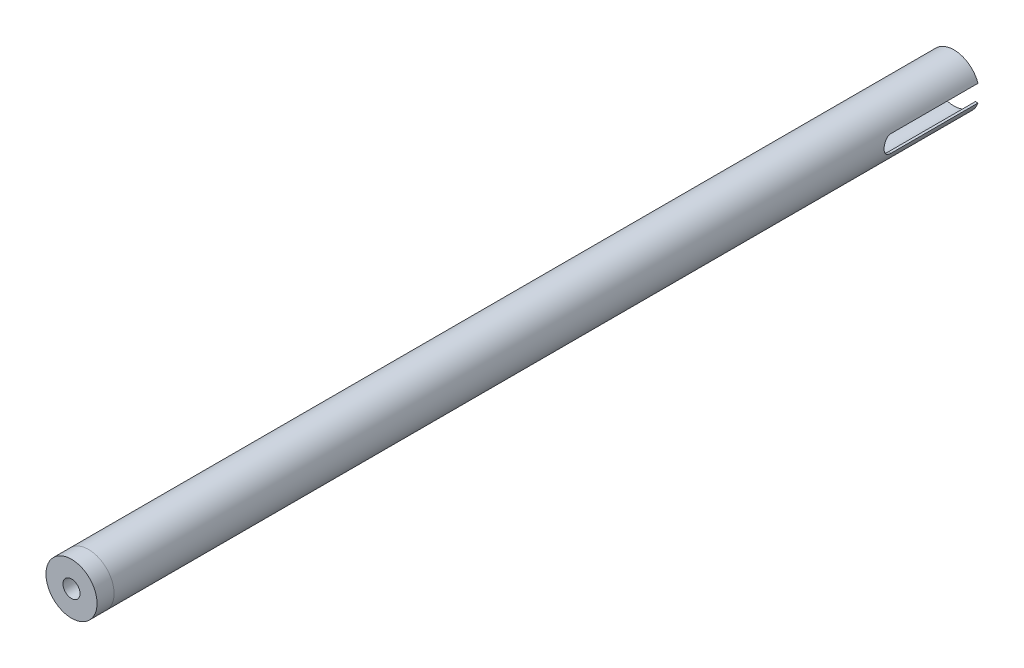
ISO-10303-21;
HEADER;
FILE_DESCRIPTION(('STEP AP214'),'2;1');
FILE_NAME('part.step','',(''),(''),'','','');
FILE_SCHEMA(('AUTOMOTIVE_DESIGN { 1 0 10303 214 1 1 1 1 }'));
ENDSEC;
DATA;
#1=APPLICATION_CONTEXT('core data for automotive mechanical design processes');
#2=APPLICATION_PROTOCOL_DEFINITION('international standard','automotive_design',2000,#1);
#3=PRODUCT_CONTEXT('',#1,'mechanical');
#4=PRODUCT('Part','Part','',(#3));
#5=PRODUCT_RELATED_PRODUCT_CATEGORY('part','',(#4));
#6=PRODUCT_DEFINITION_FORMATION('','',#4);
#7=PRODUCT_DEFINITION_CONTEXT('part definition',#1,'design');
#8=PRODUCT_DEFINITION('design','',#6,#7);
#9=PRODUCT_DEFINITION_SHAPE('','',#8);
#10=(LENGTH_UNIT() NAMED_UNIT(*) SI_UNIT(.MILLI.,.METRE.));
#11=(NAMED_UNIT(*) PLANE_ANGLE_UNIT() SI_UNIT($,.RADIAN.));
#12=(NAMED_UNIT(*) SI_UNIT($,.STERADIAN.) SOLID_ANGLE_UNIT());
#13=UNCERTAINTY_MEASURE_WITH_UNIT(LENGTH_MEASURE(1.E-05),#10,'distance_accuracy_value','');
#14=(GEOMETRIC_REPRESENTATION_CONTEXT(3) GLOBAL_UNCERTAINTY_ASSIGNED_CONTEXT((#13)) GLOBAL_UNIT_ASSIGNED_CONTEXT((#10,
#11,#12)) REPRESENTATION_CONTEXT('',''));
#15=CARTESIAN_POINT('',(0.,0.,0.));
#16=DIRECTION('',(0.,0.,1.));
#17=DIRECTION('',(1.,0.,0.));
#18=AXIS2_PLACEMENT_3D('',#15,#16,#17);
#19=CARTESIAN_POINT('',(0.,0.,-329.057104319801));
#20=DIRECTION('',(0.,0.,1.));
#21=DIRECTION('',(1.,0.,0.));
#22=AXIS2_PLACEMENT_3D('',#19,#20,#21);
#23=CYLINDRICAL_SURFACE('',#22,9.525);
#24=CARTESIAN_POINT('',(0.,0.,-6.35));
#25=DIRECTION('',(0.,0.,1.));
#26=DIRECTION('',(1.,0.,0.));
#27=AXIS2_PLACEMENT_3D('',#24,#25,#26);
#28=CIRCLE('',#27,9.525);
#29=CARTESIAN_POINT('',(9.525,0.,-6.35));
#30=VERTEX_POINT('',#29);
#31=EDGE_CURVE('E167',#30,#30,#28,.T.);
#32=ORIENTED_EDGE('',*,*,#31,.F.);
#33=EDGE_LOOP('',(#32));
#34=FACE_BOUND('',#33,.T.);
#35=CARTESIAN_POINT('',(-8.98025612106915,3.175,-296.672104319801));
#36=CARTESIAN_POINT('',(-8.98024230233901,3.17501142134308,-296.585478216465));
#37=CARTESIAN_POINT('',(-8.98150922759707,3.17145501317748,-296.498859833989));
#38=CARTESIAN_POINT('',(-8.98650170400112,3.1572955094353,-296.326295019163));
#39=CARTESIAN_POINT('',(-8.99022659113085,3.14669431699565,-296.240348411677));
#40=CARTESIAN_POINT('',(-9.00001740508998,3.11857670914846,-296.069994170512));
#41=CARTESIAN_POINT('',(-9.00607621805003,3.10108130380329,-295.985582668705));
#42=CARTESIAN_POINT('',(-9.02033586435303,3.05935434973544,-295.81864786737));
#43=CARTESIAN_POINT('',(-9.02853677497232,3.03512255799513,-295.736124636078));
#44=CARTESIAN_POINT('',(-9.05598792154067,2.95264369348964,-295.492326012802));
#45=CARTESIAN_POINT('',(-9.07810200713863,2.88457148458963,-295.334572428477));
#46=CARTESIAN_POINT('',(-9.12745136023601,2.72437908867645,-295.032695909988));
#47=CARTESIAN_POINT('',(-9.15468995097455,2.63224328129308,-294.88858191276));
#48=CARTESIAN_POINT('',(-9.21240416673121,2.42269155952414,-294.612429052936));
#49=CARTESIAN_POINT('',(-9.24296008478943,2.30449853156512,-294.480995471073));
#50=CARTESIAN_POINT('',(-9.30318902123142,2.04784031127145,-294.239400174736));
#51=CARTESIAN_POINT('',(-9.33286185998227,1.90937102786996,-294.129242763504));
#52=CARTESIAN_POINT('',(-9.38892492365178,1.61159672697579,-293.930525752016));
#53=CARTESIAN_POINT('',(-9.41520772598947,1.45183792838571,-293.842613566006));
#54=CARTESIAN_POINT('',(-9.46054712430069,1.11883883316163,-293.695208839936));
#55=CARTESIAN_POINT('',(-9.47961052807859,0.945611424033776,-293.635689511935));
#56=CARTESIAN_POINT('',(-9.50410661247238,0.642992499572378,-293.560210747439));
#57=CARTESIAN_POINT('',(-9.51189798251809,0.515662964136021,-293.536592775396));
#58=CARTESIAN_POINT('',(-9.51973491912187,0.323120458247706,-293.512926509222));
#59=CARTESIAN_POINT('',(-9.52170555244691,0.258670486244995,-293.506997861606));
#60=CARTESIAN_POINT('',(-9.52433958502699,0.129484930346662,-293.499085236939));
#61=CARTESIAN_POINT('',(-9.5250026318504,0.0647492741617735,-293.497102323375));
#62=CARTESIAN_POINT('',(-9.525,0.,-293.497104319801));
#63=B_SPLINE_CURVE_WITH_KNOTS('',3,(#35,#36,#37,#38,#39,#40,#41,#42,#43,#44,#45,#46,#47,#48,#49,
#50,#51,#52,#53,#54,#55,#56,#57,#58,#59,#60,#61,#62),.UNSPECIFIED.,.F.,.F.,(4,2,2,2,2,2,2,2,2,2,
2,2,2,4),(0.,0.259783027985017,0.519495904525387,0.77842335407941,1.0373601457496,
1.5544837070914,2.07194378605916,2.60765740005749,3.14347925237348,3.69345572792675,
4.24291228331228,4.63105001394513,4.82518498412947,5.01937227204625),.UNSPECIFIED.);
#64=CARTESIAN_POINT('',(-8.98025612106915,3.175,-296.672104319801));
#65=VERTEX_POINT('',#64);
#66=CARTESIAN_POINT('',(-9.525,0.,-293.497104319801));
#67=VERTEX_POINT('',#66);
#68=EDGE_CURVE('E194',#65,#67,#63,.T.);
#69=ORIENTED_EDGE('',*,*,#68,.T.);
#70=CARTESIAN_POINT('',(-9.525,0.,-293.497104319801));
#71=CARTESIAN_POINT('',(-9.52501110102584,-0.0867614879611047,-293.497093214763));
#72=CARTESIAN_POINT('',(-9.52381482114642,-0.173516026970688,-293.50066042642));
#73=CARTESIAN_POINT('',(-9.51909010104991,-0.346361025979108,-293.514865265002));
#74=CARTESIAN_POINT('',(-9.51556219632442,-0.432451633867625,-293.525501268479));
#75=CARTESIAN_POINT('',(-9.50626969526085,-0.603121388983429,-293.553718259993));
#76=CARTESIAN_POINT('',(-9.50051134567603,-0.687704073408636,-293.571279854162));
#77=CARTESIAN_POINT('',(-9.48692170416637,-0.854983898510564,-293.6131711748));
#78=CARTESIAN_POINT('',(-9.47909035815865,-0.937680989932468,-293.63750107785));
#79=CARTESIAN_POINT('',(-9.45278540829331,-1.18202731628102,-293.720335470788));
#80=CARTESIAN_POINT('',(-9.43148823554423,-1.3401498669332,-293.788721152133));
#81=CARTESIAN_POINT('',(-9.38354405256208,-1.64264414222568,-293.949647677909));
#82=CARTESIAN_POINT('',(-9.35689419571071,-1.78700848960572,-294.042201383063));
#83=CARTESIAN_POINT('',(-9.30002401422068,-2.06291632995426,-294.252194811268));
#84=CARTESIAN_POINT('',(-9.26971861159364,-2.19392359690272,-294.370317096687));
#85=CARTESIAN_POINT('',(-9.20941732427213,-2.43468689521897,-294.626655073522));
#86=CARTESIAN_POINT('',(-9.1794215361322,-2.54443647619592,-294.764876841681));
#87=CARTESIAN_POINT('',(-9.122187697517,-2.74268087840456,-295.062384820728));
#88=CARTESIAN_POINT('',(-9.09505529775998,-2.83046425019683,-295.222166958801));
#89=CARTESIAN_POINT('',(-9.04794936227173,-2.97762337182932,-295.555211280807));
#90=CARTESIAN_POINT('',(-9.0279682579705,-3.03702917747986,-295.728458975614));
#91=CARTESIAN_POINT('',(-9.00226999890487,-3.1122125650425,-296.030746009609));
#92=CARTESIAN_POINT('',(-8.99408207355733,-3.13569679171672,-296.157708331036));
#93=CARTESIAN_POINT('',(-8.98304472933549,-3.16711304593222,-296.413785502805));
#94=CARTESIAN_POINT('',(-8.98019613476149,-3.17504267212105,-296.542900682407));
#95=CARTESIAN_POINT('',(-8.98025612106915,-3.175,-296.672104319801));
#96=B_SPLINE_CURVE_WITH_KNOTS('',3,(#70,#71,#72,#73,#74,#75,#76,#77,#78,#79,#80,#81,#82,#83,#84,
#85,#86,#87,#88,#89,#90,#91,#92,#93,#94,#95),.UNSPECIFIED.,.F.,.F.,(4,2,2,2,2,2,2,2,2,2,2,2,4),
(0.,0.260191091827307,0.52032244773723,0.779730467212497,1.03914525511038,1.55731822615721,
2.07576750062865,2.61028978360817,3.14497400776474,3.69521752133766,4.24487695078963,
4.63199348452988,5.01916977744542),.UNSPECIFIED.);
#97=CARTESIAN_POINT('',(-8.98025612106916,-3.175,-296.672104319801));
#98=VERTEX_POINT('',#97);
#99=EDGE_CURVE('E146',#67,#98,#96,.T.);
#100=ORIENTED_EDGE('',*,*,#99,.T.);
#101=DIRECTION('',(0.,0.,-1.));
#102=VECTOR('',#101,1.);
#103=CARTESIAN_POINT('',(-8.98025612106916,-3.175,-293.497104319801));
#104=LINE('',#103,#102);
#105=CARTESIAN_POINT('',(-8.98025612106916,-3.175,-329.057104319801));
#106=VERTEX_POINT('',#105);
#107=EDGE_CURVE('E141',#98,#106,#104,.T.);
#108=ORIENTED_EDGE('',*,*,#107,.T.);
#109=CARTESIAN_POINT('',(0.,0.,-329.057104319801));
#110=DIRECTION('',(0.,0.,1.));
#111=DIRECTION('',(1.,0.,0.));
#112=AXIS2_PLACEMENT_3D('',#109,#110,#111);
#113=CIRCLE('',#112,9.525);
#114=CARTESIAN_POINT('',(8.98025612106915,-3.175,-329.057104319801));
#115=VERTEX_POINT('',#114);
#116=EDGE_CURVE('E144',#106,#115,#113,.T.);
#117=ORIENTED_EDGE('',*,*,#116,.T.);
#118=DIRECTION('',(0.,0.,-1.));
#119=VECTOR('',#118,1.);
#120=CARTESIAN_POINT('',(8.98025612106915,-3.175,-293.497104319801));
#121=LINE('',#120,#119);
#122=CARTESIAN_POINT('',(8.98025612106915,-3.175,-296.672104319801));
#123=VERTEX_POINT('',#122);
#124=EDGE_CURVE('E427',#123,#115,#121,.T.);
#125=ORIENTED_EDGE('',*,*,#124,.F.);
#126=CARTESIAN_POINT('',(8.98025612106915,-3.175,-296.672104319801));
#127=CARTESIAN_POINT('',(8.98024230233901,-3.17501142134308,-296.585478216465));
#128=CARTESIAN_POINT('',(8.98150922759707,-3.17145501317748,-296.498859833989));
#129=CARTESIAN_POINT('',(8.98650170400112,-3.1572955094353,-296.326295019163));
#130=CARTESIAN_POINT('',(8.99022659113085,-3.14669431699565,-296.240348411677));
#131=CARTESIAN_POINT('',(9.00001740508998,-3.11857670914846,-296.069994170512));
#132=CARTESIAN_POINT('',(9.00607621805003,-3.10108130380329,-295.985582668705));
#133=CARTESIAN_POINT('',(9.02033586435303,-3.05935434973544,-295.81864786737));
#134=CARTESIAN_POINT('',(9.02853677497232,-3.03512255799513,-295.736124636078));
#135=CARTESIAN_POINT('',(9.05598792154067,-2.95264369348964,-295.492326012802));
#136=CARTESIAN_POINT('',(9.07810200713863,-2.88457148458963,-295.334572428477));
#137=CARTESIAN_POINT('',(9.12745136023601,-2.72437908867645,-295.032695909988));
#138=CARTESIAN_POINT('',(9.15468995097455,-2.63224328129308,-294.88858191276));
#139=CARTESIAN_POINT('',(9.21240416673121,-2.42269155952414,-294.612429052936));
#140=CARTESIAN_POINT('',(9.24296008478943,-2.30449853156512,-294.480995471073));
#141=CARTESIAN_POINT('',(9.30318902123142,-2.04784031127145,-294.239400174736));
#142=CARTESIAN_POINT('',(9.33286185998227,-1.90937102786996,-294.129242763504));
#143=CARTESIAN_POINT('',(9.38892492365178,-1.61159672697579,-293.930525752016));
#144=CARTESIAN_POINT('',(9.41520772598947,-1.45183792838571,-293.842613566006));
#145=CARTESIAN_POINT('',(9.46054712430069,-1.11883883316163,-293.695208839936));
#146=CARTESIAN_POINT('',(9.47961052807859,-0.945611424033776,-293.635689511935));
#147=CARTESIAN_POINT('',(9.50410661247238,-0.642992499572378,-293.560210747439));
#148=CARTESIAN_POINT('',(9.51189798251809,-0.515662964136021,-293.536592775396));
#149=CARTESIAN_POINT('',(9.51973491912187,-0.323120458247706,-293.512926509222));
#150=CARTESIAN_POINT('',(9.52170555244691,-0.258670486244995,-293.506997861606));
#151=CARTESIAN_POINT('',(9.52433958502699,-0.129484930346662,-293.499085236939));
#152=CARTESIAN_POINT('',(9.5250026318504,-0.0647492741617735,-293.497102323375));
#153=CARTESIAN_POINT('',(9.525,0.,-293.497104319801));
#154=B_SPLINE_CURVE_WITH_KNOTS('',3,(#126,#127,#128,#129,#130,#131,#132,#133,#134,#135,#136,
#137,#138,#139,#140,#141,#142,#143,#144,#145,#146,#147,#148,#149,#150,#151,#152,#153),
.UNSPECIFIED.,.F.,.F.,(4,2,2,2,2,2,2,2,2,2,2,2,2,4),(0.,0.259783027985017,0.519495904525387,
0.77842335407941,1.0373601457496,1.5544837070914,2.07194378605916,2.60765740005749,
3.14347925237348,3.69345572792675,4.24291228331228,4.63105001394513,4.82518498412947,
5.01937227204625),.UNSPECIFIED.);
#155=CARTESIAN_POINT('',(9.525,0.,-293.497104319801));
#156=VERTEX_POINT('',#155);
#157=EDGE_CURVE('E87',#123,#156,#154,.T.);
#158=ORIENTED_EDGE('',*,*,#157,.T.);
#159=CARTESIAN_POINT('',(9.525,0.,-293.497104319801));
#160=CARTESIAN_POINT('',(9.52501110102584,0.0867614879611047,-293.497093214763));
#161=CARTESIAN_POINT('',(9.52381482114642,0.173516026970688,-293.50066042642));
#162=CARTESIAN_POINT('',(9.51909010104991,0.346361025979108,-293.514865265002));
#163=CARTESIAN_POINT('',(9.51556219632442,0.432451633867625,-293.525501268479));
#164=CARTESIAN_POINT('',(9.50626969526085,0.603121388983429,-293.553718259993));
#165=CARTESIAN_POINT('',(9.50051134567603,0.687704073408636,-293.571279854162));
#166=CARTESIAN_POINT('',(9.48692170416637,0.854983898510564,-293.6131711748));
#167=CARTESIAN_POINT('',(9.47909035815865,0.937680989932468,-293.63750107785));
#168=CARTESIAN_POINT('',(9.45278540829331,1.18202731628102,-293.720335470788));
#169=CARTESIAN_POINT('',(9.43148823554423,1.3401498669332,-293.788721152133));
#170=CARTESIAN_POINT('',(9.38354405256208,1.64264414222568,-293.949647677909));
#171=CARTESIAN_POINT('',(9.35689419571071,1.78700848960572,-294.042201383063));
#172=CARTESIAN_POINT('',(9.30002401422068,2.06291632995426,-294.252194811268));
#173=CARTESIAN_POINT('',(9.26971861159364,2.19392359690272,-294.370317096687));
#174=CARTESIAN_POINT('',(9.20941732427213,2.43468689521897,-294.626655073522));
#175=CARTESIAN_POINT('',(9.1794215361322,2.54443647619592,-294.764876841681));
#176=CARTESIAN_POINT('',(9.122187697517,2.74268087840456,-295.062384820728));
#177=CARTESIAN_POINT('',(9.09505529775998,2.83046425019683,-295.222166958801));
#178=CARTESIAN_POINT('',(9.04794936227173,2.97762337182932,-295.555211280807));
#179=CARTESIAN_POINT('',(9.0279682579705,3.03702917747986,-295.728458975614));
#180=CARTESIAN_POINT('',(9.00226999890487,3.1122125650425,-296.030746009609));
#181=CARTESIAN_POINT('',(8.99408207355733,3.13569679171672,-296.157708331036));
#182=CARTESIAN_POINT('',(8.98304472933549,3.16711304593222,-296.413785502805));
#183=CARTESIAN_POINT('',(8.98019613476149,3.17504267212105,-296.542900682407));
#184=CARTESIAN_POINT('',(8.98025612106915,3.175,-296.672104319801));
#185=B_SPLINE_CURVE_WITH_KNOTS('',3,(#159,#160,#161,#162,#163,#164,#165,#166,#167,#168,#169,
#170,#171,#172,#173,#174,#175,#176,#177,#178,#179,#180,#181,#182,#183,#184),.UNSPECIFIED.,.F.,
.F.,(4,2,2,2,2,2,2,2,2,2,2,2,4),(0.,0.260191091827307,0.52032244773723,0.779730467212497,
1.03914525511038,1.55731822615721,2.07576750062865,2.61028978360817,3.14497400776474,
3.69521752133766,4.24487695078963,4.63199348452988,5.01916977744542),.UNSPECIFIED.);
#186=CARTESIAN_POINT('',(8.98025612106915,3.175,-296.672104319801));
#187=VERTEX_POINT('',#186);
#188=EDGE_CURVE('E73',#156,#187,#185,.T.);
#189=ORIENTED_EDGE('',*,*,#188,.T.);
#190=DIRECTION('',(0.,0.,-1.));
#191=VECTOR('',#190,1.);
#192=CARTESIAN_POINT('',(8.98025612106915,3.175,-293.497104319801));
#193=LINE('',#192,#191);
#194=CARTESIAN_POINT('',(8.98025612106915,3.175,-329.057104319801));
#195=VERTEX_POINT('',#194);
#196=EDGE_CURVE('E160',#187,#195,#193,.T.);
#197=ORIENTED_EDGE('',*,*,#196,.T.);
#198=CARTESIAN_POINT('',(-8.98025612106915,3.175,-329.057104319801));
#199=VERTEX_POINT('',#198);
#200=EDGE_CURVE('E166',#195,#199,#113,.T.);
#201=ORIENTED_EDGE('',*,*,#200,.T.);
#202=DIRECTION('',(0.,0.,-1.));
#203=VECTOR('',#202,1.);
#204=CARTESIAN_POINT('',(-8.98025612106915,3.175,-293.497104319801));
#205=LINE('',#204,#203);
#206=EDGE_CURVE('E420',#65,#199,#205,.T.);
#207=ORIENTED_EDGE('',*,*,#206,.F.);
#208=EDGE_LOOP('',(#69,#100,#108,#117,#125,#158,#189,#197,#201,#207));
#209=FACE_BOUND('',#208,.T.);
#210=ADVANCED_FACE('F63',(#34,#209),#23,.T.);
#211=CARTESIAN_POINT('',(0.,0.,-329.057104319801));
#212=DIRECTION('',(0.,0.,1.));
#213=DIRECTION('',(1.,0.,0.));
#214=AXIS2_PLACEMENT_3D('',#211,#212,#213);
#215=PLANE('',#214);
#216=DIRECTION('',(1.,0.,0.));
#217=VECTOR('',#216,1.);
#218=CARTESIAN_POINT('',(0.,-3.175,-329.057104319801));
#219=LINE('',#218,#217);
#220=CARTESIAN_POINT('',(-8.03118117091129,-3.175,-329.057104319801));
#221=VERTEX_POINT('',#220);
#222=EDGE_CURVE('E153',#106,#221,#219,.T.);
#223=ORIENTED_EDGE('',*,*,#222,.T.);
#224=CARTESIAN_POINT('',(0.,0.,-329.057104319801));
#225=DIRECTION('',(0.,0.,1.));
#226=DIRECTION('',(1.,0.,0.));
#227=AXIS2_PLACEMENT_3D('',#224,#225,#226);
#228=CIRCLE('',#227,8.636);
#229=CARTESIAN_POINT('',(8.03118117091129,-3.175,-329.057104319801));
#230=VERTEX_POINT('',#229);
#231=EDGE_CURVE('E275',#221,#230,#228,.T.);
#232=ORIENTED_EDGE('',*,*,#231,.T.);
#233=DIRECTION('',(1.,0.,0.));
#234=VECTOR('',#233,1.);
#235=CARTESIAN_POINT('',(0.,-3.175,-329.057104319801));
#236=LINE('',#235,#234);
#237=EDGE_CURVE('E165',#230,#115,#236,.T.);
#238=ORIENTED_EDGE('',*,*,#237,.T.);
#239=ORIENTED_EDGE('',*,*,#116,.F.);
#240=EDGE_LOOP('',(#223,#232,#238,#239));
#241=FACE_BOUND('',#240,.T.);
#242=ADVANCED_FACE('F163',(#241),#215,.F.);
#243=CARTESIAN_POINT('',(0.,0.,-329.057104319801));
#244=DIRECTION('',(0.,0.,1.));
#245=DIRECTION('',(1.,0.,0.));
#246=AXIS2_PLACEMENT_3D('',#243,#244,#245);
#247=CYLINDRICAL_SURFACE('',#246,8.636);
#248=CARTESIAN_POINT('',(0.,0.,-6.35));
#249=DIRECTION('',(0.,0.,1.));
#250=DIRECTION('',(1.,0.,0.));
#251=AXIS2_PLACEMENT_3D('',#248,#249,#250);
#252=CIRCLE('',#251,8.636);
#253=CARTESIAN_POINT('',(8.636,0.,-6.35));
#254=VERTEX_POINT('',#253);
#255=EDGE_CURVE('E149',#254,#254,#252,.T.);
#256=ORIENTED_EDGE('',*,*,#255,.T.);
#257=EDGE_LOOP('',(#256));
#258=FACE_BOUND('',#257,.T.);
#259=DIRECTION('',(0.,0.,-1.));
#260=VECTOR('',#259,1.);
#261=CARTESIAN_POINT('',(-8.03118117091129,-3.175,-293.497104319801));
#262=LINE('',#261,#260);
#263=CARTESIAN_POINT('',(-8.03118117091129,-3.175,-296.672104319801));
#264=VERTEX_POINT('',#263);
#265=EDGE_CURVE('E150',#264,#221,#262,.T.);
#266=ORIENTED_EDGE('',*,*,#265,.F.);
#267=CARTESIAN_POINT('',(-8.03118117091129,-3.175,-296.672104319801));
#268=CARTESIAN_POINT('',(-8.03116550357192,-3.17501203663229,-296.586069351685));
#269=CARTESIAN_POINT('',(-8.03256328665432,-3.17150327993899,-296.500042999156));
#270=CARTESIAN_POINT('',(-8.03806891362409,-3.15753809299539,-296.328670428687));
#271=CARTESIAN_POINT('',(-8.04217588089716,-3.14708391007799,-296.24332399978));
#272=CARTESIAN_POINT('',(-8.05296421917626,-3.11937037021479,-296.074214865565));
#273=CARTESIAN_POINT('',(-8.05963650808001,-3.10213501593152,-295.990447654623));
#274=CARTESIAN_POINT('',(-8.07533202922414,-3.06104389654164,-295.824798691855));
#275=CARTESIAN_POINT('',(-8.08435537430867,-3.0371878136549,-295.742917030735));
#276=CARTESIAN_POINT('',(-8.11453837074661,-2.95603278100127,-295.50106487349));
#277=CARTESIAN_POINT('',(-8.13883087950844,-2.88909903597752,-295.344598235915));
#278=CARTESIAN_POINT('',(-8.19300406693486,-2.73167948818753,-295.04506324679));
#279=CARTESIAN_POINT('',(-8.22288931448619,-2.64117440539563,-294.902005994233));
#280=CARTESIAN_POINT('',(-8.28646461334555,-2.43457537576577,-294.626535584995));
#281=CARTESIAN_POINT('',(-8.32026315150128,-2.31754645569601,-294.494847212909));
#282=CARTESIAN_POINT('',(-8.38695072719909,-2.06320558041455,-294.252459034515));
#283=CARTESIAN_POINT('',(-8.41983956911545,-1.9258893021522,-294.141763713145));
#284=CARTESIAN_POINT('',(-8.48230406273647,-1.62932475427476,-293.940982598194));
#285=CARTESIAN_POINT('',(-8.5117351959247,-1.46950375402868,-293.851694244689));
#286=CARTESIAN_POINT('',(-8.56262575627031,-1.13591027783606,-293.701632091725));
#287=CARTESIAN_POINT('',(-8.58409342507971,-0.962152453429211,-293.640828794905));
#288=CARTESIAN_POINT('',(-8.61197450421745,-0.656412542712577,-293.562904429256));
#289=CARTESIAN_POINT('',(-8.62092967235125,-0.526538210349248,-293.538288644917));
#290=CARTESIAN_POINT('',(-8.62994176115801,-0.330020976938503,-293.513611313201));
#291=CARTESIAN_POINT('',(-8.63220903333296,-0.264206342476349,-293.507426574051));
#292=CARTESIAN_POINT('',(-8.63523992352765,-0.132266265743974,-293.499171358606));
#293=CARTESIAN_POINT('',(-8.6360031097792,-0.066140739687068,-293.497102063703));
#294=CARTESIAN_POINT('',(-8.636,0.,-293.497104319801));
#295=B_SPLINE_CURVE_WITH_KNOTS('',3,(#267,#268,#269,#270,#271,#272,#273,#274,#275,#276,#277,
#278,#279,#280,#281,#282,#283,#284,#285,#286,#287,#288,#289,#290,#291,#292,#293,#294),
.UNSPECIFIED.,.F.,.F.,(4,2,2,2,2,2,2,2,2,2,2,2,2,4),(0.,0.258007583993685,0.515931725057005,
0.77295101340558,1.02998264023838,1.54317615093284,2.05679075055082,2.59254838663377,
3.128420352877,3.68191422398171,4.23483365719865,4.63113823379684,4.82943692106889,
5.02779252437178),.UNSPECIFIED.);
#296=CARTESIAN_POINT('',(-8.636,0.,-293.497104319801));
#297=VERTEX_POINT('',#296);
#298=EDGE_CURVE('E221',#264,#297,#295,.T.);
#299=ORIENTED_EDGE('',*,*,#298,.T.);
#300=CARTESIAN_POINT('',(-8.636,0.,-293.497104319801));
#301=CARTESIAN_POINT('',(-8.63601200177566,0.0862340545028674,-293.497092746077));
#302=CARTESIAN_POINT('',(-8.63470866649585,0.172460638964019,-293.500617286098));
#303=CARTESIAN_POINT('',(-8.62956076290727,0.344245368623967,-293.514648715727));
#304=CARTESIAN_POINT('',(-8.62571686385256,0.429803683858979,-293.525153766483));
#305=CARTESIAN_POINT('',(-8.61559314175803,0.599377201936831,-293.553012520539));
#306=CARTESIAN_POINT('',(-8.60932102288695,0.683396413719323,-293.570344566395));
#307=CARTESIAN_POINT('',(-8.5945171663722,0.849553539449472,-293.61167578967));
#308=CARTESIAN_POINT('',(-8.58598535382315,0.931691390934832,-293.635675188103));
#309=CARTESIAN_POINT('',(-8.55732464851214,1.17435074221828,-293.717349369541));
#310=CARTESIAN_POINT('',(-8.53411500636261,1.33136171263576,-293.784740690507));
#311=CARTESIAN_POINT('',(-8.48180653117632,1.63181198358794,-293.943232400517));
#312=CARTESIAN_POINT('',(-8.45270389942466,1.77524244193608,-294.034348093554));
#313=CARTESIAN_POINT('',(-8.39029834803106,2.05036661398532,-294.241601211233));
#314=CARTESIAN_POINT('',(-8.35688032192871,2.1814347411356,-294.358535578825));
#315=CARTESIAN_POINT('',(-8.29018507770489,2.42260670191496,-294.612424565281));
#316=CARTESIAN_POINT('',(-8.25690791509208,2.53270290926749,-294.749386435111));
#317=CARTESIAN_POINT('',(-8.19291826363247,2.73277128594141,-295.045551523936));
#318=CARTESIAN_POINT('',(-8.16234475412034,2.82185641770732,-295.205386613373));
#319=CARTESIAN_POINT('',(-8.10906121054024,2.97153048258984,-295.538981956875));
#320=CARTESIAN_POINT('',(-8.08634169503735,3.03215380703845,-295.712725106544));
#321=CARTESIAN_POINT('',(-8.05677760160867,3.10966172606007,-296.017993741357));
#322=CARTESIAN_POINT('',(-8.04725077861386,3.13409804308654,-296.147374460563));
#323=CARTESIAN_POINT('',(-8.03764862425496,3.15860280233701,-296.343181586404));
#324=CARTESIAN_POINT('',(-8.0352292163598,3.16474613160121,-296.408774342709));
#325=CARTESIAN_POINT('',(-8.03199317651195,3.17294655384153,-296.540274295099));
#326=CARTESIAN_POINT('',(-8.03117703985816,3.17500238406813,-296.60618158205));
#327=CARTESIAN_POINT('',(-8.03118117091129,3.175,-296.672104319801));
#328=B_SPLINE_CURVE_WITH_KNOTS('',3,(#300,#301,#302,#303,#304,#305,#306,#307,#308,#309,#310,
#311,#312,#313,#314,#315,#316,#317,#318,#319,#320,#321,#322,#323,#324,#325,#326,#327),
.UNSPECIFIED.,.F.,.F.,(4,2,2,2,2,2,2,2,2,2,2,2,2,4),(0.,0.258607684277243,0.517147271349152,
0.774873208333408,1.03260768960759,1.54734347080466,2.06241212125685,2.59642224394461,
3.13062618611954,3.6844391606936,4.23758121159796,4.63245186558856,4.83009172977022,
5.0277926412787),.UNSPECIFIED.);
#329=CARTESIAN_POINT('',(-8.03118117091129,3.175,-296.672104319801));
#330=VERTEX_POINT('',#329);
#331=EDGE_CURVE('E186',#297,#330,#328,.T.);
#332=ORIENTED_EDGE('',*,*,#331,.T.);
#333=DIRECTION('',(0.,0.,-1.));
#334=VECTOR('',#333,1.);
#335=CARTESIAN_POINT('',(-8.03118117091129,3.175,-293.497104319801));
#336=LINE('',#335,#334);
#337=CARTESIAN_POINT('',(-8.03118117091129,3.175,-329.057104319801));
#338=VERTEX_POINT('',#337);
#339=EDGE_CURVE('E417',#330,#338,#336,.T.);
#340=ORIENTED_EDGE('',*,*,#339,.T.);
#341=CARTESIAN_POINT('',(8.03118117091129,3.175,-329.057104319801));
#342=VERTEX_POINT('',#341);
#343=EDGE_CURVE('E172',#342,#338,#228,.T.);
#344=ORIENTED_EDGE('',*,*,#343,.F.);
#345=DIRECTION('',(0.,0.,-1.));
#346=VECTOR('',#345,1.);
#347=CARTESIAN_POINT('',(8.03118117091129,3.175,-293.497104319801));
#348=LINE('',#347,#346);
#349=CARTESIAN_POINT('',(8.03118117091129,3.175,-296.672104319801));
#350=VERTEX_POINT('',#349);
#351=EDGE_CURVE('E269',#350,#342,#348,.T.);
#352=ORIENTED_EDGE('',*,*,#351,.F.);
#353=CARTESIAN_POINT('',(8.03118117091129,3.175,-296.672104319801));
#354=CARTESIAN_POINT('',(8.03116550357192,3.17501203663229,-296.586069351685));
#355=CARTESIAN_POINT('',(8.03256328665432,3.17150327993899,-296.500042999156));
#356=CARTESIAN_POINT('',(8.03806891362409,3.15753809299539,-296.328670428687));
#357=CARTESIAN_POINT('',(8.04217588089716,3.14708391007799,-296.24332399978));
#358=CARTESIAN_POINT('',(8.05296421917626,3.11937037021479,-296.074214865565));
#359=CARTESIAN_POINT('',(8.05963650808001,3.10213501593152,-295.990447654623));
#360=CARTESIAN_POINT('',(8.07533202922414,3.06104389654164,-295.824798691855));
#361=CARTESIAN_POINT('',(8.08435537430867,3.0371878136549,-295.742917030735));
#362=CARTESIAN_POINT('',(8.11453837074661,2.95603278100127,-295.50106487349));
#363=CARTESIAN_POINT('',(8.13883087950844,2.88909903597752,-295.344598235915));
#364=CARTESIAN_POINT('',(8.19300406693486,2.73167948818753,-295.04506324679));
#365=CARTESIAN_POINT('',(8.22288931448619,2.64117440539563,-294.902005994233));
#366=CARTESIAN_POINT('',(8.28646461334555,2.43457537576577,-294.626535584995));
#367=CARTESIAN_POINT('',(8.32026315150128,2.31754645569601,-294.494847212909));
#368=CARTESIAN_POINT('',(8.38695072719909,2.06320558041455,-294.252459034515));
#369=CARTESIAN_POINT('',(8.41983956911545,1.9258893021522,-294.141763713145));
#370=CARTESIAN_POINT('',(8.48230406273647,1.62932475427476,-293.940982598194));
#371=CARTESIAN_POINT('',(8.5117351959247,1.46950375402868,-293.851694244689));
#372=CARTESIAN_POINT('',(8.56262575627031,1.13591027783606,-293.701632091725));
#373=CARTESIAN_POINT('',(8.58409342507971,0.962152453429211,-293.640828794905));
#374=CARTESIAN_POINT('',(8.61197450421745,0.656412542712577,-293.562904429256));
#375=CARTESIAN_POINT('',(8.62092967235125,0.526538210349248,-293.538288644917));
#376=CARTESIAN_POINT('',(8.62994176115801,0.330020976938503,-293.513611313201));
#377=CARTESIAN_POINT('',(8.63220903333296,0.264206342476349,-293.507426574051));
#378=CARTESIAN_POINT('',(8.63523992352765,0.132266265743974,-293.499171358606));
#379=CARTESIAN_POINT('',(8.6360031097792,0.066140739687068,-293.497102063703));
#380=CARTESIAN_POINT('',(8.636,0.,-293.497104319801));
#381=B_SPLINE_CURVE_WITH_KNOTS('',3,(#353,#354,#355,#356,#357,#358,#359,#360,#361,#362,#363,
#364,#365,#366,#367,#368,#369,#370,#371,#372,#373,#374,#375,#376,#377,#378,#379,#380),
.UNSPECIFIED.,.F.,.F.,(4,2,2,2,2,2,2,2,2,2,2,2,2,4),(0.,0.258007583993685,0.515931725057005,
0.77295101340558,1.02998264023838,1.54317615093284,2.05679075055082,2.59254838663377,
3.128420352877,3.68191422398171,4.23483365719865,4.63113823379684,4.82943692106889,
5.02779252437178),.UNSPECIFIED.);
#382=CARTESIAN_POINT('',(8.636,0.,-293.497104319801));
#383=VERTEX_POINT('',#382);
#384=EDGE_CURVE('E13',#350,#383,#381,.T.);
#385=ORIENTED_EDGE('',*,*,#384,.T.);
#386=CARTESIAN_POINT('',(8.636,0.,-293.497104319801));
#387=CARTESIAN_POINT('',(8.63601200177566,-0.0862340545028674,-293.497092746077));
#388=CARTESIAN_POINT('',(8.63470866649585,-0.172460638964019,-293.500617286098));
#389=CARTESIAN_POINT('',(8.62956076290727,-0.344245368623967,-293.514648715727));
#390=CARTESIAN_POINT('',(8.62571686385256,-0.429803683858979,-293.525153766483));
#391=CARTESIAN_POINT('',(8.61559314175803,-0.599377201936831,-293.553012520539));
#392=CARTESIAN_POINT('',(8.60932102288695,-0.683396413719323,-293.570344566395));
#393=CARTESIAN_POINT('',(8.5945171663722,-0.849553539449472,-293.61167578967));
#394=CARTESIAN_POINT('',(8.58598535382315,-0.931691390934832,-293.635675188103));
#395=CARTESIAN_POINT('',(8.55732464851214,-1.17435074221828,-293.717349369541));
#396=CARTESIAN_POINT('',(8.53411500636261,-1.33136171263576,-293.784740690507));
#397=CARTESIAN_POINT('',(8.48180653117632,-1.63181198358794,-293.943232400517));
#398=CARTESIAN_POINT('',(8.45270389942466,-1.77524244193608,-294.034348093554));
#399=CARTESIAN_POINT('',(8.39029834803106,-2.05036661398532,-294.241601211233));
#400=CARTESIAN_POINT('',(8.35688032192871,-2.1814347411356,-294.358535578825));
#401=CARTESIAN_POINT('',(8.29018507770489,-2.42260670191496,-294.612424565281));
#402=CARTESIAN_POINT('',(8.25690791509208,-2.53270290926749,-294.749386435111));
#403=CARTESIAN_POINT('',(8.19291826363247,-2.73277128594141,-295.045551523936));
#404=CARTESIAN_POINT('',(8.16234475412034,-2.82185641770732,-295.205386613373));
#405=CARTESIAN_POINT('',(8.10906121054024,-2.97153048258984,-295.538981956875));
#406=CARTESIAN_POINT('',(8.08634169503735,-3.03215380703845,-295.712725106544));
#407=CARTESIAN_POINT('',(8.05677760160867,-3.10966172606007,-296.017993741357));
#408=CARTESIAN_POINT('',(8.04725077861386,-3.13409804308654,-296.147374460563));
#409=CARTESIAN_POINT('',(8.03764862425496,-3.15860280233701,-296.343181586404));
#410=CARTESIAN_POINT('',(8.0352292163598,-3.16474613160121,-296.408774342709));
#411=CARTESIAN_POINT('',(8.03199317651195,-3.17294655384153,-296.540274295099));
#412=CARTESIAN_POINT('',(8.03117703985816,-3.17500238406813,-296.60618158205));
#413=CARTESIAN_POINT('',(8.03118117091129,-3.175,-296.672104319801));
#414=B_SPLINE_CURVE_WITH_KNOTS('',3,(#386,#387,#388,#389,#390,#391,#392,#393,#394,#395,#396,
#397,#398,#399,#400,#401,#402,#403,#404,#405,#406,#407,#408,#409,#410,#411,#412,#413),
.UNSPECIFIED.,.F.,.F.,(4,2,2,2,2,2,2,2,2,2,2,2,2,4),(0.,0.258607684277243,0.517147271349152,
0.774873208333408,1.03260768960759,1.54734347080466,2.06241212125685,2.59642224394461,
3.13062618611954,3.6844391606936,4.23758121159796,4.63245186558856,4.83009172977022,
5.0277926412787),.UNSPECIFIED.);
#415=CARTESIAN_POINT('',(8.03118117091129,-3.175,-296.672104319801));
#416=VERTEX_POINT('',#415);
#417=EDGE_CURVE('E237',#383,#416,#414,.T.);
#418=ORIENTED_EDGE('',*,*,#417,.T.);
#419=DIRECTION('',(0.,0.,-1.));
#420=VECTOR('',#419,1.);
#421=CARTESIAN_POINT('',(8.03118117091129,-3.175,-293.497104319801));
#422=LINE('',#421,#420);
#423=EDGE_CURVE('E271',#416,#230,#422,.T.);
#424=ORIENTED_EDGE('',*,*,#423,.T.);
#425=ORIENTED_EDGE('',*,*,#231,.F.);
#426=EDGE_LOOP('',(#266,#299,#332,#340,#344,#352,#385,#418,#424,#425));
#427=FACE_BOUND('',#426,.T.);
#428=ADVANCED_FACE('F201',(#258,#427),#247,.F.);
#429=ORIENTED_EDGE('',*,*,#343,.T.);
#430=DIRECTION('',(1.,0.,0.));
#431=VECTOR('',#430,1.);
#432=CARTESIAN_POINT('',(0.,3.175,-329.057104319801));
#433=LINE('',#432,#431);
#434=EDGE_CURVE('E159',#199,#338,#433,.T.);
#435=ORIENTED_EDGE('',*,*,#434,.F.);
#436=ORIENTED_EDGE('',*,*,#200,.F.);
#437=DIRECTION('',(1.,0.,0.));
#438=VECTOR('',#437,1.);
#439=CARTESIAN_POINT('',(0.,3.175,-329.057104319801));
#440=LINE('',#439,#438);
#441=EDGE_CURVE('E253',#342,#195,#440,.T.);
#442=ORIENTED_EDGE('',*,*,#441,.F.);
#443=EDGE_LOOP('',(#429,#435,#436,#442));
#444=FACE_BOUND('',#443,.T.);
#445=ADVANCED_FACE('F286',(#444),#215,.F.);
#446=CARTESIAN_POINT('',(0.,0.,-6.35));
#447=DIRECTION('',(0.,0.,1.));
#448=DIRECTION('',(1.,0.,0.));
#449=AXIS2_PLACEMENT_3D('',#446,#447,#448);
#450=PLANE('',#449);
#451=ORIENTED_EDGE('',*,*,#255,.F.);
#452=EDGE_LOOP('',(#451));
#453=FACE_BOUND('',#452,.T.);
#454=ORIENTED_EDGE('',*,*,#31,.T.);
#455=EDGE_LOOP('',(#454));
#456=FACE_BOUND('',#455,.T.);
#457=ADVANCED_FACE('F283',(#453,#456),#450,.T.);
#458=CARTESIAN_POINT('',(0.,3.175,-293.497104319801));
#459=DIRECTION('',(0.,1.,0.));
#460=DIRECTION('',(0.,0.,1.));
#461=AXIS2_PLACEMENT_3D('',#458,#459,#460);
#462=PLANE('',#461);
#463=ORIENTED_EDGE('',*,*,#196,.F.);
#464=DIRECTION('',(1.,0.,0.));
#465=VECTOR('',#464,1.);
#466=CARTESIAN_POINT('',(8.03118117091129,3.175,-296.672104319801));
#467=LINE('',#466,#465);
#468=EDGE_CURVE('E184',#187,#350,#467,.F.);
#469=ORIENTED_EDGE('',*,*,#468,.T.);
#470=ORIENTED_EDGE('',*,*,#351,.T.);
#471=ORIENTED_EDGE('',*,*,#441,.T.);
#472=EDGE_LOOP('',(#463,#469,#470,#471));
#473=FACE_BOUND('',#472,.T.);
#474=ADVANCED_FACE('F266',(#473),#462,.F.);
#475=CARTESIAN_POINT('',(0.,-3.175,-293.497104319801));
#476=DIRECTION('',(0.,1.,0.));
#477=DIRECTION('',(0.,0.,1.));
#478=AXIS2_PLACEMENT_3D('',#475,#476,#477);
#479=PLANE('',#478);
#480=ORIENTED_EDGE('',*,*,#423,.F.);
#481=DIRECTION('',(1.,0.,0.));
#482=VECTOR('',#481,1.);
#483=CARTESIAN_POINT('',(0.,-3.175,-296.672104319801));
#484=LINE('',#483,#482);
#485=EDGE_CURVE('E181',#416,#123,#484,.T.);
#486=ORIENTED_EDGE('',*,*,#485,.T.);
#487=ORIENTED_EDGE('',*,*,#124,.T.);
#488=ORIENTED_EDGE('',*,*,#237,.F.);
#489=EDGE_LOOP('',(#480,#486,#487,#488));
#490=FACE_BOUND('',#489,.T.);
#491=ADVANCED_FACE('F361',(#490),#479,.T.);
#492=CARTESIAN_POINT('',(0.,-3.175,-293.497104319801));
#493=DIRECTION('',(0.,1.,0.));
#494=DIRECTION('',(0.,0.,1.));
#495=AXIS2_PLACEMENT_3D('',#492,#493,#494);
#496=PLANE('',#495);
#497=ORIENTED_EDGE('',*,*,#107,.F.);
#498=DIRECTION('',(1.,0.,0.));
#499=VECTOR('',#498,1.);
#500=CARTESIAN_POINT('',(0.,-3.175,-296.672104319801));
#501=LINE('',#500,#499);
#502=EDGE_CURVE('E179',#98,#264,#501,.T.);
#503=ORIENTED_EDGE('',*,*,#502,.T.);
#504=ORIENTED_EDGE('',*,*,#265,.T.);
#505=ORIENTED_EDGE('',*,*,#222,.F.);
#506=EDGE_LOOP('',(#497,#503,#504,#505));
#507=FACE_BOUND('',#506,.T.);
#508=ADVANCED_FACE('F154',(#507),#496,.T.);
#509=CARTESIAN_POINT('',(0.,3.175,-293.497104319801));
#510=DIRECTION('',(0.,1.,0.));
#511=DIRECTION('',(0.,0.,1.));
#512=AXIS2_PLACEMENT_3D('',#509,#510,#511);
#513=PLANE('',#512);
#514=ORIENTED_EDGE('',*,*,#339,.F.);
#515=DIRECTION('',(1.,0.,0.));
#516=VECTOR('',#515,1.);
#517=CARTESIAN_POINT('',(-8.98025612106915,3.175,-296.672104319801));
#518=LINE('',#517,#516);
#519=EDGE_CURVE('E170',#330,#65,#518,.F.);
#520=ORIENTED_EDGE('',*,*,#519,.T.);
#521=ORIENTED_EDGE('',*,*,#206,.T.);
#522=ORIENTED_EDGE('',*,*,#434,.T.);
#523=EDGE_LOOP('',(#514,#520,#521,#522));
#524=FACE_BOUND('',#523,.T.);
#525=ADVANCED_FACE('F216',(#524),#513,.F.);
#526=CARTESIAN_POINT('',(0.,0.,-296.672104319801));
#527=DIRECTION('',(1.,0.,0.));
#528=DIRECTION('',(0.,0.,-1.));
#529=AXIS2_PLACEMENT_3D('',#526,#527,#528);
#530=CYLINDRICAL_SURFACE('',#529,3.175);
#531=ORIENTED_EDGE('',*,*,#502,.F.);
#532=ORIENTED_EDGE('',*,*,#99,.F.);
#533=DIRECTION('',(1.,0.,0.));
#534=VECTOR('',#533,1.);
#535=CARTESIAN_POINT('',(0.,0.,-293.497104319801));
#536=LINE('',#535,#534);
#537=EDGE_CURVE('E251',#297,#67,#536,.F.);
#538=ORIENTED_EDGE('',*,*,#537,.F.);
#539=ORIENTED_EDGE('',*,*,#298,.F.);
#540=EDGE_LOOP('',(#531,#532,#538,#539));
#541=FACE_BOUND('',#540,.T.);
#542=ADVANCED_FACE('F209',(#541),#530,.F.);
#543=CARTESIAN_POINT('',(0.,0.,-296.672104319801));
#544=DIRECTION('',(-1.,0.,0.));
#545=DIRECTION('',(0.,0.,1.));
#546=AXIS2_PLACEMENT_3D('',#543,#544,#545);
#547=CYLINDRICAL_SURFACE('',#546,3.175);
#548=ORIENTED_EDGE('',*,*,#68,.F.);
#549=ORIENTED_EDGE('',*,*,#519,.F.);
#550=ORIENTED_EDGE('',*,*,#331,.F.);
#551=ORIENTED_EDGE('',*,*,#537,.T.);
#552=EDGE_LOOP('',(#548,#549,#550,#551));
#553=FACE_BOUND('',#552,.T.);
#554=ADVANCED_FACE('F205',(#553),#547,.F.);
#555=CARTESIAN_POINT('',(0.,0.,-296.672104319801));
#556=DIRECTION('',(-1.,0.,0.));
#557=DIRECTION('',(0.,0.,1.));
#558=AXIS2_PLACEMENT_3D('',#555,#556,#557);
#559=CYLINDRICAL_SURFACE('',#558,3.175);
#560=DIRECTION('',(1.,0.,0.));
#561=VECTOR('',#560,1.);
#562=CARTESIAN_POINT('',(8.98025612106915,0.,-293.497104319801));
#563=LINE('',#562,#561);
#564=EDGE_CURVE('E68',#383,#156,#563,.T.);
#565=ORIENTED_EDGE('',*,*,#564,.F.);
#566=ORIENTED_EDGE('',*,*,#384,.F.);
#567=ORIENTED_EDGE('',*,*,#468,.F.);
#568=ORIENTED_EDGE('',*,*,#188,.F.);
#569=EDGE_LOOP('',(#565,#566,#567,#568));
#570=FACE_BOUND('',#569,.T.);
#571=ADVANCED_FACE('F65',(#570),#559,.F.);
#572=CARTESIAN_POINT('',(0.,0.,-296.672104319801));
#573=DIRECTION('',(1.,0.,0.));
#574=DIRECTION('',(0.,0.,-1.));
#575=AXIS2_PLACEMENT_3D('',#572,#573,#574);
#576=CYLINDRICAL_SURFACE('',#575,3.175);
#577=ORIENTED_EDGE('',*,*,#417,.F.);
#578=ORIENTED_EDGE('',*,*,#564,.T.);
#579=ORIENTED_EDGE('',*,*,#157,.F.);
#580=ORIENTED_EDGE('',*,*,#485,.F.);
#581=EDGE_LOOP('',(#577,#578,#579,#580));
#582=FACE_BOUND('',#581,.T.);
#583=ADVANCED_FACE('F218',(#582),#576,.F.);
#584=CLOSED_SHELL('',(#210,#242,#428,#445,#457,#474,#491,#508,#525,#542,#554,#571,#583));
#585=MANIFOLD_SOLID_BREP('B2',#584);
#586=CARTESIAN_POINT('',(0.,0.,-6.35));
#587=DIRECTION('',(0.,0.,1.));
#588=DIRECTION('',(1.,0.,0.));
#589=AXIS2_PLACEMENT_3D('',#586,#587,#588);
#590=CYLINDRICAL_SURFACE('',#589,9.525);
#591=CARTESIAN_POINT('',(0.,0.,-6.35));
#592=DIRECTION('',(0.,0.,1.));
#593=DIRECTION('',(1.,0.,0.));
#594=AXIS2_PLACEMENT_3D('',#591,#592,#593);
#595=CIRCLE('',#594,9.525);
#596=CARTESIAN_POINT('',(9.525,0.,-6.35));
#597=VERTEX_POINT('',#596);
#598=EDGE_CURVE('E62',#597,#597,#595,.T.);
#599=ORIENTED_EDGE('',*,*,#598,.T.);
#600=EDGE_LOOP('',(#599));
#601=FACE_BOUND('',#600,.T.);
#602=CARTESIAN_POINT('',(0.,0.,0.));
#603=DIRECTION('',(0.,0.,1.));
#604=DIRECTION('',(1.,0.,0.));
#605=AXIS2_PLACEMENT_3D('',#602,#603,#604);
#606=CIRCLE('',#605,9.525);
#607=CARTESIAN_POINT('',(9.525,0.,0.));
#608=VERTEX_POINT('',#607);
#609=EDGE_CURVE('E465',#608,#608,#606,.T.);
#610=ORIENTED_EDGE('',*,*,#609,.F.);
#611=EDGE_LOOP('',(#610));
#612=FACE_BOUND('',#611,.T.);
#613=ADVANCED_FACE('F454',(#601,#612),#590,.T.);
#614=CARTESIAN_POINT('',(0.,0.,-6.35));
#615=DIRECTION('',(0.,0.,1.));
#616=DIRECTION('',(1.,0.,0.));
#617=AXIS2_PLACEMENT_3D('',#614,#615,#616);
#618=CYLINDRICAL_SURFACE('',#617,3.175);
#619=CARTESIAN_POINT('',(0.,0.,0.));
#620=DIRECTION('',(0.,0.,1.));
#621=DIRECTION('',(1.,0.,0.));
#622=AXIS2_PLACEMENT_3D('',#619,#620,#621);
#623=CIRCLE('',#622,3.175);
#624=CARTESIAN_POINT('',(3.175,0.,0.));
#625=VERTEX_POINT('',#624);
#626=EDGE_CURVE('E457',#625,#625,#623,.T.);
#627=ORIENTED_EDGE('',*,*,#626,.T.);
#628=EDGE_LOOP('',(#627));
#629=FACE_BOUND('',#628,.T.);
#630=CARTESIAN_POINT('',(0.,0.,-12.7));
#631=DIRECTION('',(0.,0.,1.));
#632=DIRECTION('',(1.,0.,0.));
#633=AXIS2_PLACEMENT_3D('',#630,#631,#632);
#634=CIRCLE('',#633,3.175);
#635=CARTESIAN_POINT('',(3.175,0.,-12.7));
#636=VERTEX_POINT('',#635);
#637=EDGE_CURVE('E477',#636,#636,#634,.T.);
#638=ORIENTED_EDGE('',*,*,#637,.F.);
#639=EDGE_LOOP('',(#638));
#640=FACE_BOUND('',#639,.T.);
#641=ADVANCED_FACE('F485',(#629,#640),#618,.F.);
#642=CARTESIAN_POINT('',(0.,0.,-6.35));
#643=DIRECTION('',(0.,0.,1.));
#644=DIRECTION('',(1.,0.,0.));
#645=AXIS2_PLACEMENT_3D('',#642,#643,#644);
#646=PLANE('',#645);
#647=CARTESIAN_POINT('',(0.,0.,-6.35));
#648=DIRECTION('',(0.,0.,1.));
#649=DIRECTION('',(1.,0.,0.));
#650=AXIS2_PLACEMENT_3D('',#647,#648,#649);
#651=CIRCLE('',#650,8.636);
#652=CARTESIAN_POINT('',(8.636,0.,-6.35));
#653=VERTEX_POINT('',#652);
#654=EDGE_CURVE('E467',#653,#653,#651,.T.);
#655=ORIENTED_EDGE('',*,*,#654,.T.);
#656=EDGE_LOOP('',(#655));
#657=FACE_BOUND('',#656,.T.);
#658=ORIENTED_EDGE('',*,*,#598,.F.);
#659=EDGE_LOOP('',(#658));
#660=FACE_BOUND('',#659,.T.);
#661=ADVANCED_FACE('F487',(#657,#660),#646,.F.);
#662=CARTESIAN_POINT('',(0.,0.,0.));
#663=DIRECTION('',(0.,0.,1.));
#664=DIRECTION('',(1.,0.,0.));
#665=AXIS2_PLACEMENT_3D('',#662,#663,#664);
#666=PLANE('',#665);
#667=ORIENTED_EDGE('',*,*,#609,.T.);
#668=EDGE_LOOP('',(#667));
#669=FACE_BOUND('',#668,.T.);
#670=ORIENTED_EDGE('',*,*,#626,.F.);
#671=EDGE_LOOP('',(#670));
#672=FACE_BOUND('',#671,.T.);
#673=ADVANCED_FACE('F493',(#669,#672),#666,.T.);
#674=CARTESIAN_POINT('',(0.,0.,-12.7));
#675=DIRECTION('',(0.,0.,1.));
#676=DIRECTION('',(1.,0.,0.));
#677=AXIS2_PLACEMENT_3D('',#674,#675,#676);
#678=CYLINDRICAL_SURFACE('',#677,8.636);
#679=CARTESIAN_POINT('',(0.,0.,-12.7));
#680=DIRECTION('',(0.,0.,1.));
#681=DIRECTION('',(1.,0.,0.));
#682=AXIS2_PLACEMENT_3D('',#679,#680,#681);
#683=CIRCLE('',#682,8.636);
#684=CARTESIAN_POINT('',(8.636,0.,-12.7));
#685=VERTEX_POINT('',#684);
#686=EDGE_CURVE('E470',#685,#685,#683,.T.);
#687=ORIENTED_EDGE('',*,*,#686,.T.);
#688=EDGE_LOOP('',(#687));
#689=FACE_BOUND('',#688,.T.);
#690=ORIENTED_EDGE('',*,*,#654,.F.);
#691=EDGE_LOOP('',(#690));
#692=FACE_BOUND('',#691,.T.);
#693=ADVANCED_FACE('F498',(#689,#692),#678,.T.);
#694=CARTESIAN_POINT('',(0.,0.,-12.7));
#695=DIRECTION('',(0.,0.,1.));
#696=DIRECTION('',(1.,0.,0.));
#697=AXIS2_PLACEMENT_3D('',#694,#695,#696);
#698=PLANE('',#697);
#699=ORIENTED_EDGE('',*,*,#637,.T.);
#700=EDGE_LOOP('',(#699));
#701=FACE_BOUND('',#700,.T.);
#702=ORIENTED_EDGE('',*,*,#686,.F.);
#703=EDGE_LOOP('',(#702));
#704=FACE_BOUND('',#703,.T.);
#705=ADVANCED_FACE('F482',(#701,#704),#698,.F.);
#706=CLOSED_SHELL('',(#613,#641,#661,#673,#693,#705));
#707=MANIFOLD_SOLID_BREP('B7',#706);
#708=ADVANCED_BREP_SHAPE_REPRESENTATION('',(#18,#585,#707),#14);
#709=SHAPE_DEFINITION_REPRESENTATION(#9,#708);
ENDSEC;
END-ISO-10303-21;
